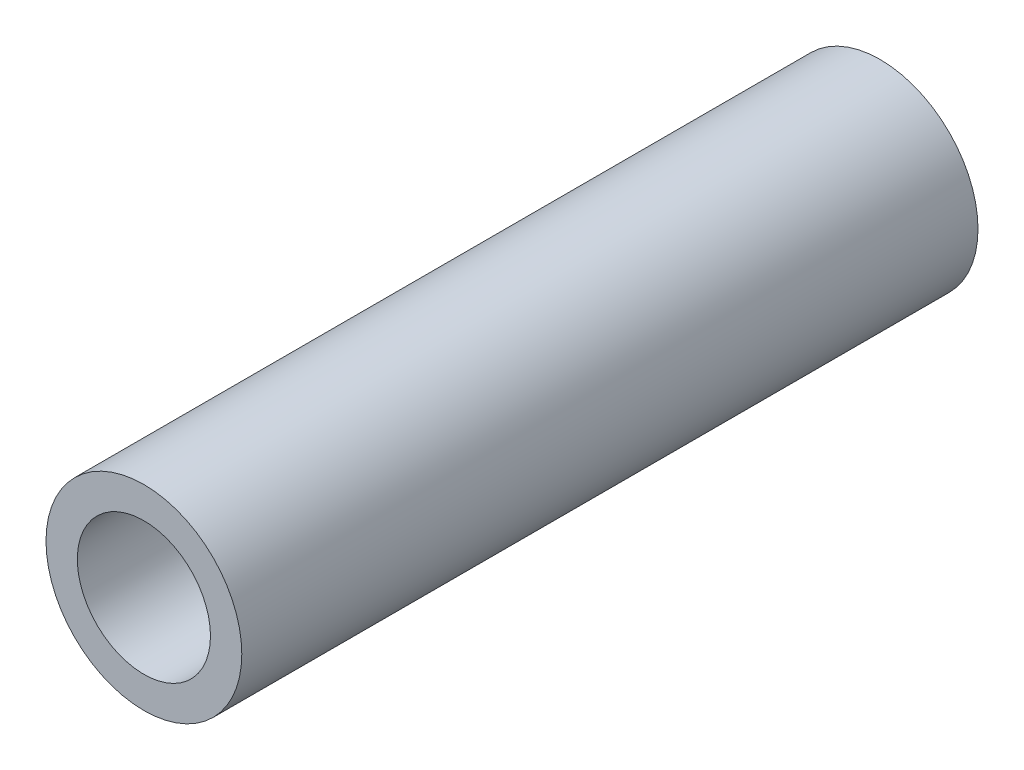
ISO-10303-21;
HEADER;
FILE_DESCRIPTION(('STEP AP214'),'2;1');
FILE_NAME('part.step','',(''),(''),'','','');
FILE_SCHEMA(('AUTOMOTIVE_DESIGN { 1 0 10303 214 1 1 1 1 }'));
ENDSEC;
DATA;
#1=APPLICATION_CONTEXT('core data for automotive mechanical design processes');
#2=APPLICATION_PROTOCOL_DEFINITION('international standard','automotive_design',2000,#1);
#3=PRODUCT_CONTEXT('',#1,'mechanical');
#4=PRODUCT('Part','Part','',(#3));
#5=PRODUCT_RELATED_PRODUCT_CATEGORY('part','',(#4));
#6=PRODUCT_DEFINITION_FORMATION('','',#4);
#7=PRODUCT_DEFINITION_CONTEXT('part definition',#1,'design');
#8=PRODUCT_DEFINITION('design','',#6,#7);
#9=PRODUCT_DEFINITION_SHAPE('','',#8);
#10=(LENGTH_UNIT() NAMED_UNIT(*) SI_UNIT(.MILLI.,.METRE.));
#11=(NAMED_UNIT(*) PLANE_ANGLE_UNIT() SI_UNIT($,.RADIAN.));
#12=(NAMED_UNIT(*) SI_UNIT($,.STERADIAN.) SOLID_ANGLE_UNIT());
#13=UNCERTAINTY_MEASURE_WITH_UNIT(LENGTH_MEASURE(1.E-05),#10,'distance_accuracy_value','');
#14=(GEOMETRIC_REPRESENTATION_CONTEXT(3) GLOBAL_UNCERTAINTY_ASSIGNED_CONTEXT((#13)) GLOBAL_UNIT_ASSIGNED_CONTEXT((#10,
#11,#12)) REPRESENTATION_CONTEXT('',''));
#15=CARTESIAN_POINT('',(0.,0.,0.));
#16=DIRECTION('',(0.,0.,1.));
#17=DIRECTION('',(1.,0.,0.));
#18=AXIS2_PLACEMENT_3D('',#15,#16,#17);
#19=CARTESIAN_POINT('',(0.,0.,18.8));
#20=DIRECTION('',(0.,0.,-1.));
#21=DIRECTION('',(-1.,0.,0.));
#22=AXIS2_PLACEMENT_3D('',#19,#20,#21);
#23=CYLINDRICAL_SURFACE('',#22,2.5);
#24=CARTESIAN_POINT('',(0.,0.,18.8));
#25=DIRECTION('',(0.,0.,1.));
#26=DIRECTION('',(1.,0.,0.));
#27=AXIS2_PLACEMENT_3D('',#24,#25,#26);
#28=CIRCLE('',#27,2.5);
#29=CARTESIAN_POINT('',(2.5,0.,18.8));
#30=VERTEX_POINT('',#29);
#31=EDGE_CURVE('E10',#30,#30,#28,.T.);
#32=ORIENTED_EDGE('',*,*,#31,.F.);
#33=EDGE_LOOP('',(#32));
#34=FACE_BOUND('',#33,.T.);
#35=CARTESIAN_POINT('',(0.,0.,0.));
#36=DIRECTION('',(0.,0.,1.));
#37=DIRECTION('',(1.,0.,0.));
#38=AXIS2_PLACEMENT_3D('',#35,#36,#37);
#39=CIRCLE('',#38,2.5);
#40=CARTESIAN_POINT('',(2.5,0.,0.));
#41=VERTEX_POINT('',#40);
#42=EDGE_CURVE('E52',#41,#41,#39,.T.);
#43=ORIENTED_EDGE('',*,*,#42,.T.);
#44=EDGE_LOOP('',(#43));
#45=FACE_BOUND('',#44,.T.);
#46=ADVANCED_FACE('F43',(#34,#45),#23,.T.);
#47=CARTESIAN_POINT('',(0.,0.,18.8));
#48=DIRECTION('',(0.,0.,1.));
#49=DIRECTION('',(1.,0.,0.));
#50=AXIS2_PLACEMENT_3D('',#47,#48,#49);
#51=PLANE('',#50);
#52=CARTESIAN_POINT('',(0.,0.,18.800012));
#53=DIRECTION('',(0.,0.,1.));
#54=DIRECTION('',(1.,0.,0.));
#55=AXIS2_PLACEMENT_3D('',#52,#53,#54);
#56=CIRCLE('',#55,1.7);
#57=CARTESIAN_POINT('',(1.7,0.,18.800012));
#58=VERTEX_POINT('',#57);
#59=EDGE_CURVE('E68',#58,#58,#56,.T.);
#60=ORIENTED_EDGE('',*,*,#59,.F.);
#61=EDGE_LOOP('',(#60));
#62=FACE_BOUND('',#61,.T.);
#63=ORIENTED_EDGE('',*,*,#31,.T.);
#64=EDGE_LOOP('',(#63));
#65=FACE_BOUND('',#64,.T.);
#66=ADVANCED_FACE('F69',(#62,#65),#51,.T.);
#67=CARTESIAN_POINT('',(0.,0.,0.));
#68=DIRECTION('',(0.,0.,1.));
#69=DIRECTION('',(1.,0.,0.));
#70=AXIS2_PLACEMENT_3D('',#67,#68,#69);
#71=PLANE('',#70);
#72=CARTESIAN_POINT('',(0.,0.,0.));
#73=DIRECTION('',(0.,0.,1.));
#74=DIRECTION('',(1.,0.,0.));
#75=AXIS2_PLACEMENT_3D('',#72,#73,#74);
#76=CIRCLE('',#75,1.7);
#77=CARTESIAN_POINT('',(1.7,0.,0.));
#78=VERTEX_POINT('',#77);
#79=EDGE_CURVE('E56',#78,#78,#76,.T.);
#80=ORIENTED_EDGE('',*,*,#79,.T.);
#81=EDGE_LOOP('',(#80));
#82=FACE_BOUND('',#81,.T.);
#83=ORIENTED_EDGE('',*,*,#42,.F.);
#84=EDGE_LOOP('',(#83));
#85=FACE_BOUND('',#84,.T.);
#86=ADVANCED_FACE('F79',(#82,#85),#71,.F.);
#87=CARTESIAN_POINT('',(0.,0.,0.));
#88=DIRECTION('',(0.,0.,1.));
#89=DIRECTION('',(1.,0.,0.));
#90=AXIS2_PLACEMENT_3D('',#87,#88,#89);
#91=CYLINDRICAL_SURFACE('',#90,1.7);
#92=ORIENTED_EDGE('',*,*,#79,.F.);
#93=EDGE_LOOP('',(#92));
#94=FACE_BOUND('',#93,.T.);
#95=ORIENTED_EDGE('',*,*,#59,.T.);
#96=EDGE_LOOP('',(#95));
#97=FACE_BOUND('',#96,.T.);
#98=ADVANCED_FACE('F81',(#94,#97),#91,.F.);
#99=CLOSED_SHELL('',(#46,#66,#86,#98));
#100=MANIFOLD_SOLID_BREP('B2',#99);
#101=ADVANCED_BREP_SHAPE_REPRESENTATION('',(#18,#100),#14);
#102=SHAPE_DEFINITION_REPRESENTATION(#9,#101);
ENDSEC;
END-ISO-10303-21;
